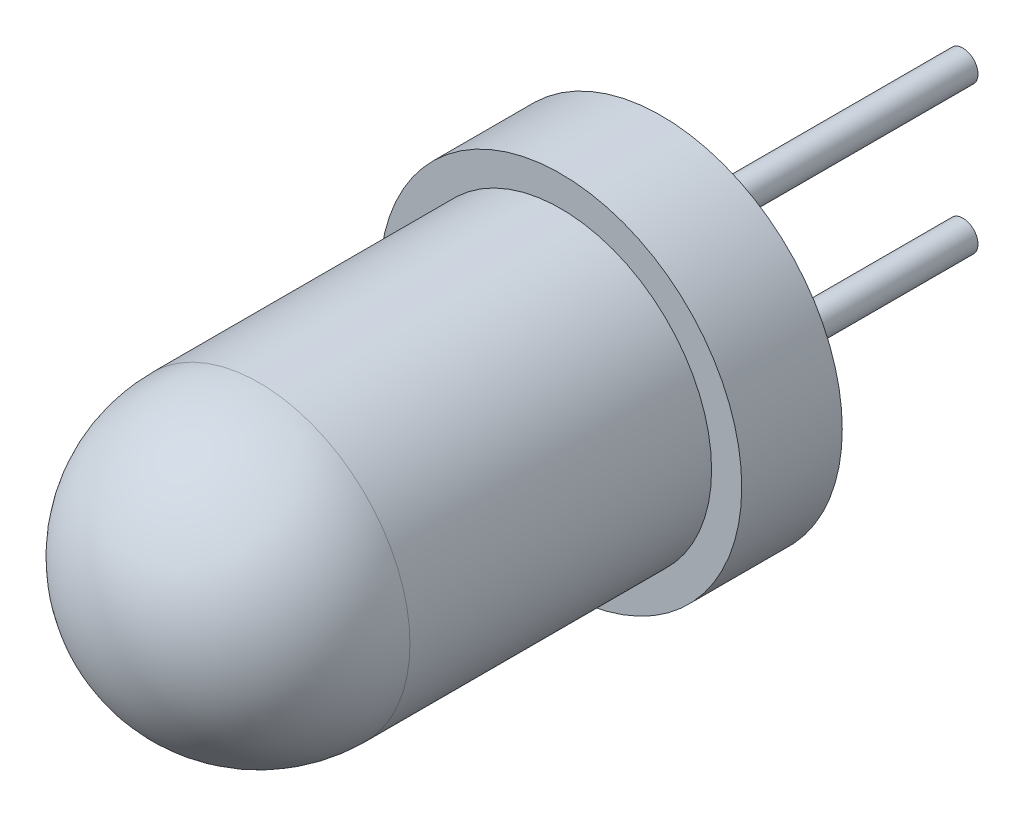
ISO-10303-21;
HEADER;
FILE_DESCRIPTION(('STEP AP214'),'2;1');
FILE_NAME('part.step','',(''),(''),'','','');
FILE_SCHEMA(('AUTOMOTIVE_DESIGN { 1 0 10303 214 1 1 1 1 }'));
ENDSEC;
DATA;
#1=APPLICATION_CONTEXT('core data for automotive mechanical design processes');
#2=APPLICATION_PROTOCOL_DEFINITION('international standard','automotive_design',2000,#1);
#3=PRODUCT_CONTEXT('',#1,'mechanical');
#4=PRODUCT('Part','Part','',(#3));
#5=PRODUCT_RELATED_PRODUCT_CATEGORY('part','',(#4));
#6=PRODUCT_DEFINITION_FORMATION('','',#4);
#7=PRODUCT_DEFINITION_CONTEXT('part definition',#1,'design');
#8=PRODUCT_DEFINITION('design','',#6,#7);
#9=PRODUCT_DEFINITION_SHAPE('','',#8);
#10=(LENGTH_UNIT() NAMED_UNIT(*) SI_UNIT(.MILLI.,.METRE.));
#11=(NAMED_UNIT(*) PLANE_ANGLE_UNIT() SI_UNIT($,.RADIAN.));
#12=(NAMED_UNIT(*) SI_UNIT($,.STERADIAN.) SOLID_ANGLE_UNIT());
#13=UNCERTAINTY_MEASURE_WITH_UNIT(LENGTH_MEASURE(1.E-05),#10,'distance_accuracy_value','');
#14=(GEOMETRIC_REPRESENTATION_CONTEXT(3) GLOBAL_UNCERTAINTY_ASSIGNED_CONTEXT((#13)) GLOBAL_UNIT_ASSIGNED_CONTEXT((#10,
#11,#12)) REPRESENTATION_CONTEXT('',''));
#15=CARTESIAN_POINT('',(0.,0.,0.));
#16=DIRECTION('',(0.,0.,1.));
#17=DIRECTION('',(1.,0.,0.));
#18=AXIS2_PLACEMENT_3D('',#15,#16,#17);
#19=CARTESIAN_POINT('',(0.,0.,0.));
#20=DIRECTION('',(0.,0.,1.));
#21=DIRECTION('',(1.,0.,0.));
#22=AXIS2_PLACEMENT_3D('',#19,#20,#21);
#23=PLANE('',#22);
#24=CARTESIAN_POINT('',(0.,-0.732458837578776,0.));
#25=DIRECTION('',(0.,0.,1.));
#26=DIRECTION('',(1.,0.,0.));
#27=AXIS2_PLACEMENT_3D('',#24,#25,#26);
#28=CIRCLE('',#27,0.149962486252659);
#29=CARTESIAN_POINT('',(0.149962486252659,-0.732458837578776,0.));
#30=VERTEX_POINT('',#29);
#31=EDGE_CURVE('E38',#30,#30,#28,.F.);
#32=ORIENTED_EDGE('',*,*,#31,.F.);
#33=EDGE_LOOP('',(#32));
#34=FACE_BOUND('',#33,.T.);
#35=CARTESIAN_POINT('',(0.,0.,0.));
#36=DIRECTION('',(0.,0.,1.));
#37=DIRECTION('',(1.,0.,0.));
#38=AXIS2_PLACEMENT_3D('',#35,#36,#37);
#39=CIRCLE('',#38,1.8);
#40=CARTESIAN_POINT('',(1.8,0.,0.));
#41=VERTEX_POINT('',#40);
#42=EDGE_CURVE('E46',#41,#41,#39,.T.);
#43=ORIENTED_EDGE('',*,*,#42,.F.);
#44=EDGE_LOOP('',(#43));
#45=FACE_BOUND('',#44,.T.);
#46=CARTESIAN_POINT('',(0.,0.732458837578776,0.));
#47=DIRECTION('',(0.,0.,1.));
#48=DIRECTION('',(1.,0.,0.));
#49=AXIS2_PLACEMENT_3D('',#46,#47,#48);
#50=CIRCLE('',#49,0.149962486252659);
#51=CARTESIAN_POINT('',(0.149962486252659,0.732458837578776,0.));
#52=VERTEX_POINT('',#51);
#53=EDGE_CURVE('E10',#52,#52,#50,.F.);
#54=ORIENTED_EDGE('',*,*,#53,.F.);
#55=EDGE_LOOP('',(#54));
#56=FACE_BOUND('',#55,.T.);
#57=ADVANCED_FACE('F31',(#34,#45,#56),#23,.F.);
#58=CARTESIAN_POINT('',(0.,0.,1.));
#59=DIRECTION('',(0.,0.,1.));
#60=DIRECTION('',(1.,0.,0.));
#61=AXIS2_PLACEMENT_3D('',#58,#59,#60);
#62=PLANE('',#61);
#63=CARTESIAN_POINT('',(0.,0.,1.));
#64=DIRECTION('',(0.,0.,1.));
#65=DIRECTION('',(1.,0.,0.));
#66=AXIS2_PLACEMENT_3D('',#63,#64,#65);
#67=CIRCLE('',#66,1.8);
#68=CARTESIAN_POINT('',(1.8,0.,1.));
#69=VERTEX_POINT('',#68);
#70=EDGE_CURVE('E42',#69,#69,#67,.T.);
#71=ORIENTED_EDGE('',*,*,#70,.T.);
#72=EDGE_LOOP('',(#71));
#73=FACE_BOUND('',#72,.T.);
#74=CARTESIAN_POINT('',(0.,0.,1.));
#75=DIRECTION('',(0.,0.,1.));
#76=DIRECTION('',(1.,0.,0.));
#77=AXIS2_PLACEMENT_3D('',#74,#75,#76);
#78=CIRCLE('',#77,1.5);
#79=CARTESIAN_POINT('',(1.5,0.,1.));
#80=VERTEX_POINT('',#79);
#81=EDGE_CURVE('E52',#80,#80,#78,.T.);
#82=ORIENTED_EDGE('',*,*,#81,.F.);
#83=EDGE_LOOP('',(#82));
#84=FACE_BOUND('',#83,.T.);
#85=ADVANCED_FACE('F79',(#73,#84),#62,.T.);
#86=CARTESIAN_POINT('',(0.,0.,1.));
#87=DIRECTION('',(0.,0.,-1.));
#88=DIRECTION('',(-1.,0.,0.));
#89=AXIS2_PLACEMENT_3D('',#86,#87,#88);
#90=CYLINDRICAL_SURFACE('',#89,1.8);
#91=ORIENTED_EDGE('',*,*,#70,.F.);
#92=EDGE_LOOP('',(#91));
#93=FACE_BOUND('',#92,.T.);
#94=ORIENTED_EDGE('',*,*,#42,.T.);
#95=EDGE_LOOP('',(#94));
#96=FACE_BOUND('',#95,.T.);
#97=ADVANCED_FACE('F33',(#93,#96),#90,.T.);
#98=CARTESIAN_POINT('',(0.,0.,4.));
#99=DIRECTION('',(0.,0.,-1.));
#100=DIRECTION('',(-1.,0.,0.));
#101=AXIS2_PLACEMENT_3D('',#98,#99,#100);
#102=CYLINDRICAL_SURFACE('',#101,1.5);
#103=CARTESIAN_POINT('',(0.,0.,4.));
#104=DIRECTION('',(0.,0.,1.));
#105=DIRECTION('',(1.,0.,0.));
#106=AXIS2_PLACEMENT_3D('',#103,#104,#105);
#107=CIRCLE('',#106,1.5);
#108=CARTESIAN_POINT('',(1.5,0.,4.));
#109=VERTEX_POINT('',#108);
#110=EDGE_CURVE('E50',#109,#109,#107,.T.);
#111=ORIENTED_EDGE('',*,*,#110,.F.);
#112=EDGE_LOOP('',(#111));
#113=FACE_BOUND('',#112,.T.);
#114=ORIENTED_EDGE('',*,*,#81,.T.);
#115=EDGE_LOOP('',(#114));
#116=FACE_BOUND('',#115,.T.);
#117=ADVANCED_FACE('F88',(#113,#116),#102,.T.);
#118=CARTESIAN_POINT('',(0.,-0.732458837578776,-3.));
#119=DIRECTION('',(0.,0.,1.));
#120=DIRECTION('',(1.,0.,0.));
#121=AXIS2_PLACEMENT_3D('',#118,#119,#120);
#122=CYLINDRICAL_SURFACE('',#121,0.149962486252659);
#123=CARTESIAN_POINT('',(0.,-0.732458837578776,-3.));
#124=DIRECTION('',(0.,0.,-1.));
#125=DIRECTION('',(-1.,0.,0.));
#126=AXIS2_PLACEMENT_3D('',#123,#124,#125);
#127=CIRCLE('',#126,0.149962486252659);
#128=CARTESIAN_POINT('',(-0.149962486252659,-0.732458837578776,-3.));
#129=VERTEX_POINT('',#128);
#130=EDGE_CURVE('E55',#129,#129,#127,.T.);
#131=ORIENTED_EDGE('',*,*,#130,.F.);
#132=EDGE_LOOP('',(#131));
#133=FACE_BOUND('',#132,.T.);
#134=ORIENTED_EDGE('',*,*,#31,.T.);
#135=EDGE_LOOP('',(#134));
#136=FACE_BOUND('',#135,.T.);
#137=ADVANCED_FACE('F91',(#133,#136),#122,.T.);
#138=CARTESIAN_POINT('',(0.,-0.732458837578776,-3.));
#139=DIRECTION('',(0.,0.,-1.));
#140=DIRECTION('',(-1.,0.,0.));
#141=AXIS2_PLACEMENT_3D('',#138,#139,#140);
#142=PLANE('',#141);
#143=ORIENTED_EDGE('',*,*,#130,.T.);
#144=EDGE_LOOP('',(#143));
#145=FACE_BOUND('',#144,.T.);
#146=ADVANCED_FACE('F75',(#145),#142,.T.);
#147=CARTESIAN_POINT('',(0.,0.,4.));
#148=DIRECTION('',(0.,0.,-1.));
#149=DIRECTION('',(-1.,0.,0.));
#150=AXIS2_PLACEMENT_3D('',#147,#148,#149);
#151=SPHERICAL_SURFACE('',#150,1.5);
#152=ORIENTED_EDGE('',*,*,#110,.T.);
#153=EDGE_LOOP('',(#152));
#154=FACE_BOUND('',#153,.T.);
#155=ADVANCED_FACE('F68',(#154),#151,.T.);
#156=CARTESIAN_POINT('',(0.,0.732458837578776,-3.));
#157=DIRECTION('',(0.,0.,1.));
#158=DIRECTION('',(1.,0.,0.));
#159=AXIS2_PLACEMENT_3D('',#156,#157,#158);
#160=CYLINDRICAL_SURFACE('',#159,0.149962486252659);
#161=CARTESIAN_POINT('',(0.,0.732458837578776,-3.));
#162=DIRECTION('',(0.,0.,-1.));
#163=DIRECTION('',(1.,0.,0.));
#164=AXIS2_PLACEMENT_3D('',#161,#162,#163);
#165=CIRCLE('',#164,0.149962486252659);
#166=CARTESIAN_POINT('',(0.149962486252659,0.732458837578776,-3.));
#167=VERTEX_POINT('',#166);
#168=EDGE_CURVE('E60',#167,#167,#165,.T.);
#169=ORIENTED_EDGE('',*,*,#168,.F.);
#170=EDGE_LOOP('',(#169));
#171=FACE_BOUND('',#170,.T.);
#172=ORIENTED_EDGE('',*,*,#53,.T.);
#173=EDGE_LOOP('',(#172));
#174=FACE_BOUND('',#173,.T.);
#175=ADVANCED_FACE('F66',(#171,#174),#160,.T.);
#176=CARTESIAN_POINT('',(0.,0.732458837578776,-3.));
#177=DIRECTION('',(0.,0.,-1.));
#178=DIRECTION('',(1.,0.,0.));
#179=AXIS2_PLACEMENT_3D('',#176,#177,#178);
#180=PLANE('',#179);
#181=ORIENTED_EDGE('',*,*,#168,.T.);
#182=EDGE_LOOP('',(#181));
#183=FACE_BOUND('',#182,.T.);
#184=ADVANCED_FACE('F64',(#183),#180,.T.);
#185=CLOSED_SHELL('',(#57,#85,#97,#117,#137,#146,#155,#175,#184));
#186=MANIFOLD_SOLID_BREP('B2',#185);
#187=ADVANCED_BREP_SHAPE_REPRESENTATION('',(#18,#186),#14);
#188=SHAPE_DEFINITION_REPRESENTATION(#9,#187);
ENDSEC;
END-ISO-10303-21;
